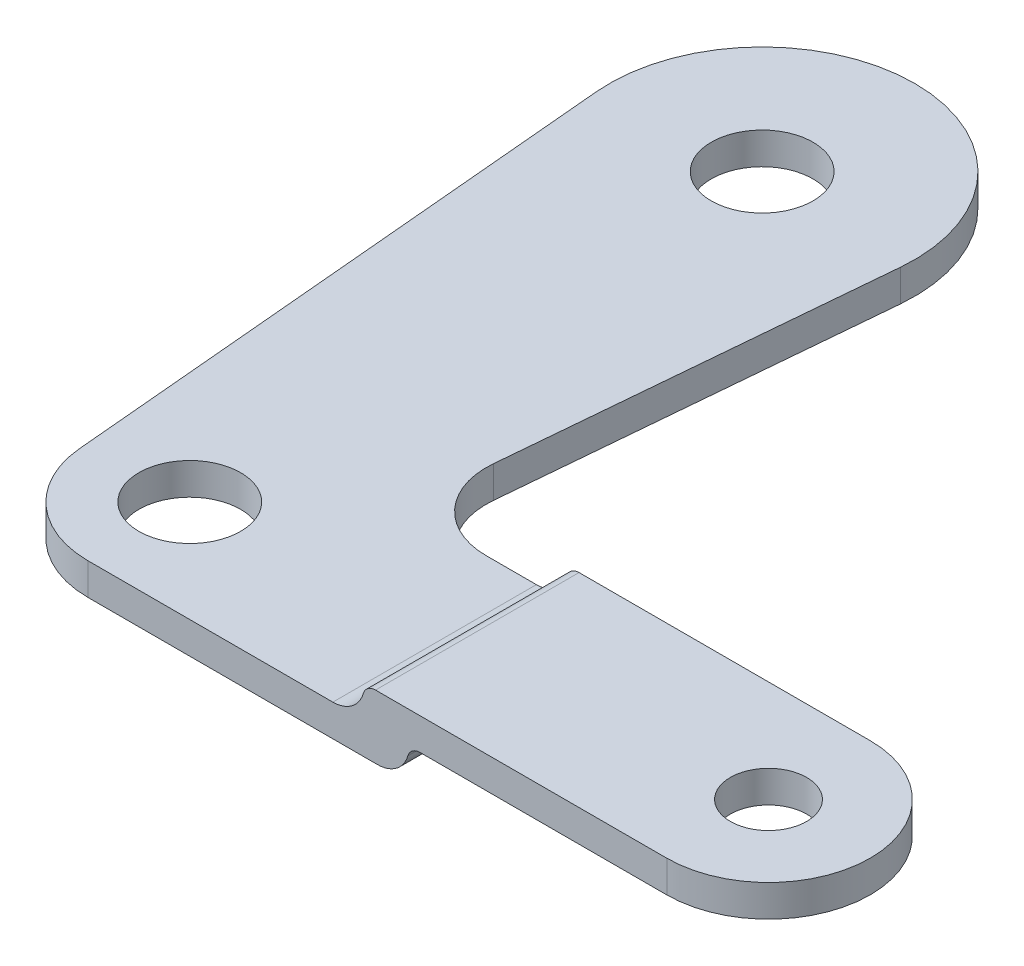
ISO-10303-21;
HEADER;
FILE_DESCRIPTION(('STEP AP214'),'2;1');
FILE_NAME('part.step','',(''),(''),'','','');
FILE_SCHEMA(('AUTOMOTIVE_DESIGN { 1 0 10303 214 1 1 1 1 }'));
ENDSEC;
DATA;
#1=APPLICATION_CONTEXT('core data for automotive mechanical design processes');
#2=APPLICATION_PROTOCOL_DEFINITION('international standard','automotive_design',2000,#1);
#3=PRODUCT_CONTEXT('',#1,'mechanical');
#4=PRODUCT('Part','Part','',(#3));
#5=PRODUCT_RELATED_PRODUCT_CATEGORY('part','',(#4));
#6=PRODUCT_DEFINITION_FORMATION('','',#4);
#7=PRODUCT_DEFINITION_CONTEXT('part definition',#1,'design');
#8=PRODUCT_DEFINITION('design','',#6,#7);
#9=PRODUCT_DEFINITION_SHAPE('','',#8);
#10=(LENGTH_UNIT() NAMED_UNIT(*) SI_UNIT(.MILLI.,.METRE.));
#11=(NAMED_UNIT(*) PLANE_ANGLE_UNIT() SI_UNIT($,.RADIAN.));
#12=(NAMED_UNIT(*) SI_UNIT($,.STERADIAN.) SOLID_ANGLE_UNIT());
#13=UNCERTAINTY_MEASURE_WITH_UNIT(LENGTH_MEASURE(1.E-05),#10,'distance_accuracy_value','');
#14=(GEOMETRIC_REPRESENTATION_CONTEXT(3) GLOBAL_UNCERTAINTY_ASSIGNED_CONTEXT((#13)) GLOBAL_UNIT_ASSIGNED_CONTEXT((#10,
#11,#12)) REPRESENTATION_CONTEXT('',''));
#15=CARTESIAN_POINT('',(0.,0.,0.));
#16=DIRECTION('',(0.,0.,1.));
#17=DIRECTION('',(1.,0.,0.));
#18=AXIS2_PLACEMENT_3D('',#15,#16,#17);
#19=CARTESIAN_POINT('',(0.,-2.5,0.));
#20=DIRECTION('',(0.,-1.,0.));
#21=DIRECTION('',(0.,0.,1.));
#22=AXIS2_PLACEMENT_3D('',#19,#20,#21);
#23=PLANE('',#22);
#24=CARTESIAN_POINT('',(45.5,-2.5,0.));
#25=DIRECTION('',(0.,1.,0.));
#26=DIRECTION('',(0.,0.,1.));
#27=AXIS2_PLACEMENT_3D('',#24,#25,#26);
#28=CIRCLE('',#27,3.);
#29=CARTESIAN_POINT('',(45.5,-2.5,2.99999999999999));
#30=VERTEX_POINT('',#29);
#31=EDGE_CURVE('E296',#30,#30,#28,.T.);
#32=ORIENTED_EDGE('',*,*,#31,.T.);
#33=EDGE_LOOP('',(#32));
#34=FACE_BOUND('',#33,.T.);
#35=DIRECTION('',(-1.,0.,0.));
#36=VECTOR('',#35,1.);
#37=CARTESIAN_POINT('',(0.,-2.5,-8.));
#38=LINE('',#37,#36);
#39=CARTESIAN_POINT('',(45.5,-2.5,-8.00000000000001));
#40=VERTEX_POINT('',#39);
#41=CARTESIAN_POINT('',(26.1041019662497,-2.5,-8.00000000000001));
#42=VERTEX_POINT('',#41);
#43=EDGE_CURVE('E287',#40,#42,#38,.T.);
#44=ORIENTED_EDGE('',*,*,#43,.F.);
#45=CARTESIAN_POINT('',(45.5,-2.5,0.));
#46=DIRECTION('',(0.,1.,0.));
#47=DIRECTION('',(0.,0.,1.));
#48=AXIS2_PLACEMENT_3D('',#45,#46,#47);
#49=CIRCLE('',#48,8.00000000000001);
#50=CARTESIAN_POINT('',(45.5,-2.5,8.00000000000001));
#51=VERTEX_POINT('',#50);
#52=EDGE_CURVE('E283',#40,#51,#49,.F.);
#53=ORIENTED_EDGE('',*,*,#52,.T.);
#54=DIRECTION('',(-1.,0.,0.));
#55=VECTOR('',#54,1.);
#56=CARTESIAN_POINT('',(0.,-2.5,8.00000000000002));
#57=LINE('',#56,#55);
#58=CARTESIAN_POINT('',(26.1041019662497,-2.5,8.00000000000002));
#59=VERTEX_POINT('',#58);
#60=EDGE_CURVE('E292',#51,#59,#57,.T.);
#61=ORIENTED_EDGE('',*,*,#60,.T.);
#62=DIRECTION('',(0.,0.,1.));
#63=VECTOR('',#62,1.);
#64=CARTESIAN_POINT('',(26.1041019662497,-2.5,-7.99999999999998));
#65=LINE('',#64,#63);
#66=EDGE_CURVE('E265',#42,#59,#65,.T.);
#67=ORIENTED_EDGE('',*,*,#66,.F.);
#68=EDGE_LOOP('',(#44,#53,#61,#67));
#69=FACE_BOUND('',#68,.T.);
#70=ADVANCED_FACE('F100',(#34,#69),#23,.T.);
#71=CARTESIAN_POINT('',(45.5,-2.5,0.));
#72=DIRECTION('',(0.,1.,0.));
#73=DIRECTION('',(0.,0.,-1.));
#74=AXIS2_PLACEMENT_3D('',#71,#72,#73);
#75=CYLINDRICAL_SURFACE('',#74,8.00000000000001);
#76=CARTESIAN_POINT('',(45.5,0.,0.));
#77=DIRECTION('',(0.,1.,0.));
#78=DIRECTION('',(0.,0.,1.));
#79=AXIS2_PLACEMENT_3D('',#76,#77,#78);
#80=CIRCLE('',#79,8.00000000000001);
#81=CARTESIAN_POINT('',(45.5,0.,-8.00000000000001));
#82=VERTEX_POINT('',#81);
#83=CARTESIAN_POINT('',(45.5,0.,8.00000000000001));
#84=VERTEX_POINT('',#83);
#85=EDGE_CURVE('E268',#82,#84,#80,.F.);
#86=ORIENTED_EDGE('',*,*,#85,.T.);
#87=DIRECTION('',(0.,1.,0.));
#88=VECTOR('',#87,1.);
#89=CARTESIAN_POINT('',(45.5,-2.5,8.00000000000001));
#90=LINE('',#89,#88);
#91=EDGE_CURVE('E109',#51,#84,#90,.T.);
#92=ORIENTED_EDGE('',*,*,#91,.F.);
#93=ORIENTED_EDGE('',*,*,#52,.F.);
#94=DIRECTION('',(0.,1.,0.));
#95=VECTOR('',#94,1.);
#96=CARTESIAN_POINT('',(45.5,-2.5,-8.00000000000001));
#97=LINE('',#96,#95);
#98=EDGE_CURVE('E12',#40,#82,#97,.T.);
#99=ORIENTED_EDGE('',*,*,#98,.T.);
#100=EDGE_LOOP('',(#86,#92,#93,#99));
#101=FACE_BOUND('',#100,.T.);
#102=ADVANCED_FACE('F102',(#101),#75,.T.);
#103=CARTESIAN_POINT('',(0.,-2.5,-8.));
#104=DIRECTION('',(0.,0.,1.));
#105=DIRECTION('',(1.,0.,0.));
#106=AXIS2_PLACEMENT_3D('',#103,#104,#105);
#107=PLANE('',#106);
#108=CARTESIAN_POINT('',(19.25,0.,-7.99999999999998));
#109=DIRECTION('',(0.,0.,-1.));
#110=DIRECTION('',(1.,0.,0.));
#111=AXIS2_PLACEMENT_3D('',#108,#109,#110);
#112=CIRCLE('',#111,2.5);
#113=CARTESIAN_POINT('',(19.25,-2.5,-8.00000000000001));
#114=VERTEX_POINT('',#113);
#115=CARTESIAN_POINT('',(21.6457871187498,-0.714285714285715,-7.99999999999998));
#116=VERTEX_POINT('',#115);
#117=EDGE_CURVE('E236',#114,#116,#112,.F.);
#118=ORIENTED_EDGE('',*,*,#117,.T.);
#119=CARTESIAN_POINT('',(22.6041019662497,-1.,-7.99999999999998));
#120=DIRECTION('',(0.,0.,-1.));
#121=DIRECTION('',(1.,0.,0.));
#122=AXIS2_PLACEMENT_3D('',#119,#120,#121);
#123=CIRCLE('',#122,1.);
#124=CARTESIAN_POINT('',(22.6041019662497,0.,-7.99999999999998));
#125=VERTEX_POINT('',#124);
#126=EDGE_CURVE('E240',#116,#125,#123,.T.);
#127=ORIENTED_EDGE('',*,*,#126,.T.);
#128=DIRECTION('',(-1.,0.,0.));
#129=VECTOR('',#128,1.);
#130=CARTESIAN_POINT('',(0.,0.,-8.));
#131=LINE('',#130,#129);
#132=EDGE_CURVE('E303',#82,#125,#131,.T.);
#133=ORIENTED_EDGE('',*,*,#132,.F.);
#134=ORIENTED_EDGE('',*,*,#98,.F.);
#135=ORIENTED_EDGE('',*,*,#43,.T.);
#136=CARTESIAN_POINT('',(26.1041019662497,-3.5,-7.99999999999998));
#137=DIRECTION('',(0.,0.,-1.));
#138=DIRECTION('',(1.,0.,0.));
#139=AXIS2_PLACEMENT_3D('',#136,#137,#138);
#140=CIRCLE('',#139,1.);
#141=CARTESIAN_POINT('',(25.1457871187498,-3.21428571428572,-7.99999999999998));
#142=VERTEX_POINT('',#141);
#143=EDGE_CURVE('E123',#142,#42,#140,.T.);
#144=ORIENTED_EDGE('',*,*,#143,.F.);
#145=CARTESIAN_POINT('',(22.75,-2.5,-7.99999999999998));
#146=DIRECTION('',(0.,0.,-1.));
#147=DIRECTION('',(1.,0.,0.));
#148=AXIS2_PLACEMENT_3D('',#145,#146,#147);
#149=CIRCLE('',#148,2.5);
#150=CARTESIAN_POINT('',(22.75,-5.,-7.99999999999998));
#151=VERTEX_POINT('',#150);
#152=EDGE_CURVE('E234',#151,#142,#149,.F.);
#153=ORIENTED_EDGE('',*,*,#152,.F.);
#154=DIRECTION('',(-1.,0.,0.));
#155=VECTOR('',#154,1.);
#156=CARTESIAN_POINT('',(0.,-5.,-7.99999999999998));
#157=LINE('',#156,#155);
#158=CARTESIAN_POINT('',(15.3050286650834,-5.,-8.));
#159=VERTEX_POINT('',#158);
#160=EDGE_CURVE('E211',#151,#159,#157,.T.);
#161=ORIENTED_EDGE('',*,*,#160,.T.);
#162=DIRECTION('',(0.,1.,0.));
#163=VECTOR('',#162,1.);
#164=CARTESIAN_POINT('',(15.3050286650834,-5.,-8.));
#165=LINE('',#164,#163);
#166=CARTESIAN_POINT('',(15.3050286650834,-2.5,-8.));
#167=VERTEX_POINT('',#166);
#168=EDGE_CURVE('E221',#159,#167,#165,.T.);
#169=ORIENTED_EDGE('',*,*,#168,.T.);
#170=DIRECTION('',(1.,0.,0.));
#171=VECTOR('',#170,1.);
#172=CARTESIAN_POINT('',(0.,-2.5,-8.));
#173=LINE('',#172,#171);
#174=EDGE_CURVE('E375',#167,#114,#173,.T.);
#175=ORIENTED_EDGE('',*,*,#174,.T.);
#176=EDGE_LOOP('',(#118,#127,#133,#134,#135,#144,#153,#161,#169,#175));
#177=FACE_BOUND('',#176,.T.);
#178=ADVANCED_FACE('F232',(#177),#107,.F.);
#179=CARTESIAN_POINT('',(0.,-2.5,8.00000000000002));
#180=DIRECTION('',(0.,0.,1.));
#181=DIRECTION('',(1.,0.,0.));
#182=AXIS2_PLACEMENT_3D('',#179,#180,#181);
#183=PLANE('',#182);
#184=DIRECTION('',(1.,0.,0.));
#185=VECTOR('',#184,1.);
#186=CARTESIAN_POINT('',(0.,-2.5,8.00000000000002));
#187=LINE('',#186,#185);
#188=CARTESIAN_POINT('',(0.,-2.5,8.00000000000001));
#189=VERTEX_POINT('',#188);
#190=CARTESIAN_POINT('',(19.25,-2.5,8.00000000000002));
#191=VERTEX_POINT('',#190);
#192=EDGE_CURVE('E218',#189,#191,#187,.T.);
#193=ORIENTED_EDGE('',*,*,#192,.F.);
#194=DIRECTION('',(0.,1.,0.));
#195=VECTOR('',#194,1.);
#196=CARTESIAN_POINT('',(0.,-5.,8.00000000000001));
#197=LINE('',#196,#195);
#198=CARTESIAN_POINT('',(0.,-5.,8.00000000000001));
#199=VERTEX_POINT('',#198);
#200=EDGE_CURVE('E345',#199,#189,#197,.T.);
#201=ORIENTED_EDGE('',*,*,#200,.F.);
#202=DIRECTION('',(-1.,0.,0.));
#203=VECTOR('',#202,1.);
#204=CARTESIAN_POINT('',(0.,-5.,8.00000000000002));
#205=LINE('',#204,#203);
#206=CARTESIAN_POINT('',(22.75,-5.,8.00000000000002));
#207=VERTEX_POINT('',#206);
#208=EDGE_CURVE('E254',#207,#199,#205,.T.);
#209=ORIENTED_EDGE('',*,*,#208,.F.);
#210=CARTESIAN_POINT('',(22.75,-2.5,8.00000000000002));
#211=DIRECTION('',(0.,0.,-1.));
#212=DIRECTION('',(1.,0.,0.));
#213=AXIS2_PLACEMENT_3D('',#210,#211,#212);
#214=CIRCLE('',#213,2.5);
#215=CARTESIAN_POINT('',(25.1457871187498,-3.21428571428572,8.00000000000002));
#216=VERTEX_POINT('',#215);
#217=EDGE_CURVE('E251',#207,#216,#214,.F.);
#218=ORIENTED_EDGE('',*,*,#217,.T.);
#219=CARTESIAN_POINT('',(26.1041019662497,-3.5,8.00000000000002));
#220=DIRECTION('',(0.,0.,-1.));
#221=DIRECTION('',(1.,0.,0.));
#222=AXIS2_PLACEMENT_3D('',#219,#220,#221);
#223=CIRCLE('',#222,1.);
#224=EDGE_CURVE('E116',#216,#59,#223,.T.);
#225=ORIENTED_EDGE('',*,*,#224,.T.);
#226=ORIENTED_EDGE('',*,*,#60,.F.);
#227=ORIENTED_EDGE('',*,*,#91,.T.);
#228=DIRECTION('',(-1.,0.,0.));
#229=VECTOR('',#228,1.);
#230=CARTESIAN_POINT('',(0.,0.,8.00000000000002));
#231=LINE('',#230,#229);
#232=CARTESIAN_POINT('',(22.6041019662497,0.,8.00000000000002));
#233=VERTEX_POINT('',#232);
#234=EDGE_CURVE('E307',#84,#233,#231,.T.);
#235=ORIENTED_EDGE('',*,*,#234,.T.);
#236=CARTESIAN_POINT('',(22.6041019662497,-1.,8.00000000000002));
#237=DIRECTION('',(0.,0.,-1.));
#238=DIRECTION('',(1.,0.,0.));
#239=AXIS2_PLACEMENT_3D('',#236,#237,#238);
#240=CIRCLE('',#239,1.);
#241=CARTESIAN_POINT('',(21.6457871187498,-0.714285714285715,8.00000000000002));
#242=VERTEX_POINT('',#241);
#243=EDGE_CURVE('E261',#242,#233,#240,.T.);
#244=ORIENTED_EDGE('',*,*,#243,.F.);
#245=CARTESIAN_POINT('',(19.25,0.,8.00000000000002));
#246=DIRECTION('',(0.,0.,-1.));
#247=DIRECTION('',(1.,0.,0.));
#248=AXIS2_PLACEMENT_3D('',#245,#246,#247);
#249=CIRCLE('',#248,2.5);
#250=EDGE_CURVE('E257',#191,#242,#249,.F.);
#251=ORIENTED_EDGE('',*,*,#250,.F.);
#252=EDGE_LOOP('',(#193,#201,#209,#218,#225,#226,#227,#235,#244,#251));
#253=FACE_BOUND('',#252,.T.);
#254=ADVANCED_FACE('F316',(#253),#183,.T.);
#255=CARTESIAN_POINT('',(45.5,-2.5,0.));
#256=DIRECTION('',(0.,1.,0.));
#257=DIRECTION('',(0.,0.,-1.));
#258=AXIS2_PLACEMENT_3D('',#255,#256,#257);
#259=CYLINDRICAL_SURFACE('',#258,3.);
#260=ORIENTED_EDGE('',*,*,#31,.F.);
#261=EDGE_LOOP('',(#260));
#262=FACE_BOUND('',#261,.T.);
#263=CARTESIAN_POINT('',(45.5,0.,0.));
#264=DIRECTION('',(0.,1.,0.));
#265=DIRECTION('',(0.,0.,1.));
#266=AXIS2_PLACEMENT_3D('',#263,#264,#265);
#267=CIRCLE('',#266,3.);
#268=CARTESIAN_POINT('',(45.5,0.,2.99999999999999));
#269=VERTEX_POINT('',#268);
#270=EDGE_CURVE('E288',#269,#269,#267,.T.);
#271=ORIENTED_EDGE('',*,*,#270,.T.);
#272=EDGE_LOOP('',(#271));
#273=FACE_BOUND('',#272,.T.);
#274=ADVANCED_FACE('F428',(#262,#273),#259,.F.);
#275=CARTESIAN_POINT('',(0.,0.,0.));
#276=DIRECTION('',(0.,-1.,0.));
#277=DIRECTION('',(0.,0.,1.));
#278=AXIS2_PLACEMENT_3D('',#275,#276,#277);
#279=PLANE('',#278);
#280=ORIENTED_EDGE('',*,*,#85,.F.);
#281=ORIENTED_EDGE('',*,*,#132,.T.);
#282=DIRECTION('',(0.,0.,1.));
#283=VECTOR('',#282,1.);
#284=CARTESIAN_POINT('',(22.6041019662497,0.,-7.99999999999998));
#285=LINE('',#284,#283);
#286=EDGE_CURVE('E269',#125,#233,#285,.T.);
#287=ORIENTED_EDGE('',*,*,#286,.T.);
#288=ORIENTED_EDGE('',*,*,#234,.F.);
#289=EDGE_LOOP('',(#280,#281,#287,#288));
#290=FACE_BOUND('',#289,.T.);
#291=ORIENTED_EDGE('',*,*,#270,.F.);
#292=EDGE_LOOP('',(#291));
#293=FACE_BOUND('',#292,.T.);
#294=ADVANCED_FACE('F322',(#290,#293),#279,.F.);
#295=CARTESIAN_POINT('',(26.1041019662497,-3.5,-7.99999999999998));
#296=DIRECTION('',(0.,0.,1.));
#297=DIRECTION('',(1.,0.,0.));
#298=AXIS2_PLACEMENT_3D('',#295,#296,#297);
#299=CYLINDRICAL_SURFACE('',#298,1.);
#300=ORIENTED_EDGE('',*,*,#224,.F.);
#301=DIRECTION('',(0.,0.,1.));
#302=VECTOR('',#301,1.);
#303=CARTESIAN_POINT('',(25.1457871187498,-3.21428571428572,-7.99999999999998));
#304=LINE('',#303,#302);
#305=EDGE_CURVE('E248',#142,#216,#304,.T.);
#306=ORIENTED_EDGE('',*,*,#305,.F.);
#307=ORIENTED_EDGE('',*,*,#143,.T.);
#308=ORIENTED_EDGE('',*,*,#66,.T.);
#309=EDGE_LOOP('',(#300,#306,#307,#308));
#310=FACE_BOUND('',#309,.T.);
#311=ADVANCED_FACE('F404',(#310),#299,.F.);
#312=CARTESIAN_POINT('',(22.6041019662497,-1.,-7.99999999999998));
#313=DIRECTION('',(0.,0.,1.));
#314=DIRECTION('',(1.,0.,0.));
#315=AXIS2_PLACEMENT_3D('',#312,#313,#314);
#316=CYLINDRICAL_SURFACE('',#315,1.);
#317=ORIENTED_EDGE('',*,*,#243,.T.);
#318=ORIENTED_EDGE('',*,*,#286,.F.);
#319=ORIENTED_EDGE('',*,*,#126,.F.);
#320=DIRECTION('',(0.,0.,1.));
#321=VECTOR('',#320,1.);
#322=CARTESIAN_POINT('',(21.6457871187498,-0.714285714285715,-7.99999999999998));
#323=LINE('',#322,#321);
#324=EDGE_CURVE('E272',#116,#242,#323,.T.);
#325=ORIENTED_EDGE('',*,*,#324,.T.);
#326=EDGE_LOOP('',(#317,#318,#319,#325));
#327=FACE_BOUND('',#326,.T.);
#328=ADVANCED_FACE('F326',(#327),#316,.T.);
#329=CARTESIAN_POINT('',(19.25,0.,-7.99999999999998));
#330=DIRECTION('',(0.,0.,1.));
#331=DIRECTION('',(1.,0.,0.));
#332=AXIS2_PLACEMENT_3D('',#329,#330,#331);
#333=CYLINDRICAL_SURFACE('',#332,2.5);
#334=ORIENTED_EDGE('',*,*,#250,.T.);
#335=ORIENTED_EDGE('',*,*,#324,.F.);
#336=ORIENTED_EDGE('',*,*,#117,.F.);
#337=DIRECTION('',(0.,0.,1.));
#338=VECTOR('',#337,1.);
#339=CARTESIAN_POINT('',(19.25,-2.5,-7.99999999999998));
#340=LINE('',#339,#338);
#341=EDGE_CURVE('E275',#114,#191,#340,.T.);
#342=ORIENTED_EDGE('',*,*,#341,.T.);
#343=EDGE_LOOP('',(#334,#335,#336,#342));
#344=FACE_BOUND('',#343,.T.);
#345=ADVANCED_FACE('F408',(#344),#333,.F.);
#346=CARTESIAN_POINT('',(0.,-5.,-7.99999999999998));
#347=DIRECTION('',(0.,-1.,0.));
#348=DIRECTION('',(0.,0.,1.));
#349=AXIS2_PLACEMENT_3D('',#346,#347,#348);
#350=PLANE('',#349);
#351=ORIENTED_EDGE('',*,*,#208,.T.);
#352=CARTESIAN_POINT('',(0.,-5.,0.));
#353=DIRECTION('',(0.,1.,0.));
#354=DIRECTION('',(0.,0.,1.));
#355=AXIS2_PLACEMENT_3D('',#352,#353,#354);
#356=CIRCLE('',#355,8.00000000000001);
#357=CARTESIAN_POINT('',(-7.96833238436088,-5.,0.71111111111111));
#358=VERTEX_POINT('',#357);
#359=EDGE_CURVE('E349',#358,#199,#356,.T.);
#360=ORIENTED_EDGE('',*,*,#359,.F.);
#361=DIRECTION('',(-0.0888888888888889,0.,-0.99604154804511));
#362=VECTOR('',#361,1.);
#363=CARTESIAN_POINT('',(-7.96833238436088,-5.,0.711111111111111));
#364=LINE('',#363,#362);
#365=CARTESIAN_POINT('',(-11.9524985765413,-5.,-43.9333333333334));
#366=VERTEX_POINT('',#365);
#367=EDGE_CURVE('E362',#358,#366,#364,.T.);
#368=ORIENTED_EDGE('',*,*,#367,.T.);
#369=CARTESIAN_POINT('',(0.,-5.,-45.));
#370=DIRECTION('',(0.,1.,0.));
#371=DIRECTION('',(0.,0.,1.));
#372=AXIS2_PLACEMENT_3D('',#369,#370,#371);
#373=CIRCLE('',#372,12.);
#374=CARTESIAN_POINT('',(11.9524985765413,-5.,-43.9333333333334));
#375=VERTEX_POINT('',#374);
#376=EDGE_CURVE('E366',#375,#366,#373,.T.);
#377=ORIENTED_EDGE('',*,*,#376,.F.);
#378=DIRECTION('',(0.0888888888888885,0.,-0.99604154804511));
#379=VECTOR('',#378,1.);
#380=CARTESIAN_POINT('',(7.9683323843609,-5.,0.71111111111111));
#381=LINE('',#380,#379);
#382=CARTESIAN_POINT('',(9.32877937681275,-5.,-14.5333333333333));
#383=VERTEX_POINT('',#382);
#384=EDGE_CURVE('E215',#383,#375,#381,.T.);
#385=ORIENTED_EDGE('',*,*,#384,.F.);
#386=CARTESIAN_POINT('',(15.3050286650834,-5.,-14.));
#387=DIRECTION('',(0.,1.,0.));
#388=DIRECTION('',(0.,0.,1.));
#389=AXIS2_PLACEMENT_3D('',#386,#387,#388);
#390=CIRCLE('',#389,6.);
#391=EDGE_CURVE('E205',#383,#159,#390,.T.);
#392=ORIENTED_EDGE('',*,*,#391,.T.);
#393=ORIENTED_EDGE('',*,*,#160,.F.);
#394=DIRECTION('',(0.,0.,1.));
#395=VECTOR('',#394,1.);
#396=CARTESIAN_POINT('',(22.75,-5.,-7.99999999999998));
#397=LINE('',#396,#395);
#398=EDGE_CURVE('E278',#151,#207,#397,.T.);
#399=ORIENTED_EDGE('',*,*,#398,.T.);
#400=EDGE_LOOP('',(#351,#360,#368,#377,#385,#392,#393,#399));
#401=FACE_BOUND('',#400,.T.);
#402=CARTESIAN_POINT('',(0.,-5.,0.));
#403=DIRECTION('',(0.,1.,0.));
#404=DIRECTION('',(0.,0.,1.));
#405=AXIS2_PLACEMENT_3D('',#402,#403,#404);
#406=CIRCLE('',#405,4.);
#407=CARTESIAN_POINT('',(0.,-5.,4.));
#408=VERTEX_POINT('',#407);
#409=EDGE_CURVE('E378',#408,#408,#406,.T.);
#410=ORIENTED_EDGE('',*,*,#409,.T.);
#411=EDGE_LOOP('',(#410));
#412=FACE_BOUND('',#411,.T.);
#413=CARTESIAN_POINT('',(0.,-5.,-45.));
#414=DIRECTION('',(0.,1.,0.));
#415=DIRECTION('',(0.,0.,1.));
#416=AXIS2_PLACEMENT_3D('',#413,#414,#415);
#417=CIRCLE('',#416,4.);
#418=CARTESIAN_POINT('',(0.,-5.,-41.));
#419=VERTEX_POINT('',#418);
#420=EDGE_CURVE('E561',#419,#419,#417,.T.);
#421=ORIENTED_EDGE('',*,*,#420,.T.);
#422=EDGE_LOOP('',(#421));
#423=FACE_BOUND('',#422,.T.);
#424=ADVANCED_FACE('F208',(#401,#412,#423),#350,.T.);
#425=CARTESIAN_POINT('',(22.75,-2.5,-7.99999999999998));
#426=DIRECTION('',(0.,0.,1.));
#427=DIRECTION('',(1.,0.,0.));
#428=AXIS2_PLACEMENT_3D('',#425,#426,#427);
#429=CYLINDRICAL_SURFACE('',#428,2.5);
#430=ORIENTED_EDGE('',*,*,#217,.F.);
#431=ORIENTED_EDGE('',*,*,#398,.F.);
#432=ORIENTED_EDGE('',*,*,#152,.T.);
#433=ORIENTED_EDGE('',*,*,#305,.T.);
#434=EDGE_LOOP('',(#430,#431,#432,#433));
#435=FACE_BOUND('',#434,.T.);
#436=ADVANCED_FACE('F403',(#435),#429,.T.);
#437=CARTESIAN_POINT('',(15.3050286650834,-2.5,-14.));
#438=DIRECTION('',(0.,-1.,0.));
#439=DIRECTION('',(0.,0.,1.));
#440=AXIS2_PLACEMENT_3D('',#437,#438,#439);
#441=PLANE('',#440);
#442=ORIENTED_EDGE('',*,*,#341,.F.);
#443=ORIENTED_EDGE('',*,*,#174,.F.);
#444=CARTESIAN_POINT('',(15.3050286650834,-2.5,-14.));
#445=DIRECTION('',(0.,1.,0.));
#446=DIRECTION('',(0.,0.,1.));
#447=AXIS2_PLACEMENT_3D('',#444,#445,#446);
#448=CIRCLE('',#447,6.);
#449=CARTESIAN_POINT('',(9.32877937681275,-2.5,-14.5333333333333));
#450=VERTEX_POINT('',#449);
#451=EDGE_CURVE('E224',#450,#167,#448,.T.);
#452=ORIENTED_EDGE('',*,*,#451,.F.);
#453=DIRECTION('',(0.0888888888888885,0.,-0.99604154804511));
#454=VECTOR('',#453,1.);
#455=CARTESIAN_POINT('',(7.9683323843609,-2.5,0.71111111111111));
#456=LINE('',#455,#454);
#457=CARTESIAN_POINT('',(11.9524985765413,-2.5,-43.9333333333334));
#458=VERTEX_POINT('',#457);
#459=EDGE_CURVE('E381',#450,#458,#456,.T.);
#460=ORIENTED_EDGE('',*,*,#459,.T.);
#461=CARTESIAN_POINT('',(0.,-2.5,-45.));
#462=DIRECTION('',(0.,1.,0.));
#463=DIRECTION('',(0.,0.,1.));
#464=AXIS2_PLACEMENT_3D('',#461,#462,#463);
#465=CIRCLE('',#464,12.);
#466=CARTESIAN_POINT('',(-11.9524985765413,-2.5,-43.9333333333334));
#467=VERTEX_POINT('',#466);
#468=EDGE_CURVE('E385',#458,#467,#465,.T.);
#469=ORIENTED_EDGE('',*,*,#468,.T.);
#470=DIRECTION('',(-0.0888888888888889,0.,-0.99604154804511));
#471=VECTOR('',#470,1.);
#472=CARTESIAN_POINT('',(-7.96833238436088,-2.5,0.711111111111111));
#473=LINE('',#472,#471);
#474=CARTESIAN_POINT('',(-7.96833238436088,-2.5,0.71111111111111));
#475=VERTEX_POINT('',#474);
#476=EDGE_CURVE('E341',#475,#467,#473,.T.);
#477=ORIENTED_EDGE('',*,*,#476,.F.);
#478=CARTESIAN_POINT('',(0.,-2.5,0.));
#479=DIRECTION('',(0.,1.,0.));
#480=DIRECTION('',(0.,0.,1.));
#481=AXIS2_PLACEMENT_3D('',#478,#479,#480);
#482=CIRCLE('',#481,8.00000000000001);
#483=EDGE_CURVE('E336',#475,#189,#482,.T.);
#484=ORIENTED_EDGE('',*,*,#483,.T.);
#485=ORIENTED_EDGE('',*,*,#192,.T.);
#486=EDGE_LOOP('',(#442,#443,#452,#460,#469,#477,#484,#485));
#487=FACE_BOUND('',#486,.T.);
#488=CARTESIAN_POINT('',(0.,-2.5,0.));
#489=DIRECTION('',(0.,1.,0.));
#490=DIRECTION('',(0.,0.,1.));
#491=AXIS2_PLACEMENT_3D('',#488,#489,#490);
#492=CIRCLE('',#491,4.);
#493=CARTESIAN_POINT('',(0.,-2.5,4.));
#494=VERTEX_POINT('',#493);
#495=EDGE_CURVE('E569',#494,#494,#492,.T.);
#496=ORIENTED_EDGE('',*,*,#495,.F.);
#497=EDGE_LOOP('',(#496));
#498=FACE_BOUND('',#497,.T.);
#499=CARTESIAN_POINT('',(0.,-2.5,-45.));
#500=DIRECTION('',(0.,1.,0.));
#501=DIRECTION('',(0.,0.,1.));
#502=AXIS2_PLACEMENT_3D('',#499,#500,#501);
#503=CIRCLE('',#502,4.);
#504=CARTESIAN_POINT('',(0.,-2.5,-41.));
#505=VERTEX_POINT('',#504);
#506=EDGE_CURVE('E564',#505,#505,#503,.T.);
#507=ORIENTED_EDGE('',*,*,#506,.F.);
#508=EDGE_LOOP('',(#507));
#509=FACE_BOUND('',#508,.T.);
#510=ADVANCED_FACE('F332',(#487,#498,#509),#441,.F.);
#511=CARTESIAN_POINT('',(15.3050286650834,-5.,-14.));
#512=DIRECTION('',(0.,1.,0.));
#513=DIRECTION('',(0.,0.,-1.));
#514=AXIS2_PLACEMENT_3D('',#511,#512,#513);
#515=CYLINDRICAL_SURFACE('',#514,6.);
#516=ORIENTED_EDGE('',*,*,#451,.T.);
#517=ORIENTED_EDGE('',*,*,#168,.F.);
#518=ORIENTED_EDGE('',*,*,#391,.F.);
#519=DIRECTION('',(0.,1.,0.));
#520=VECTOR('',#519,1.);
#521=CARTESIAN_POINT('',(9.32877937681275,-5.,-14.5333333333333));
#522=LINE('',#521,#520);
#523=EDGE_CURVE('E229',#383,#450,#522,.T.);
#524=ORIENTED_EDGE('',*,*,#523,.T.);
#525=EDGE_LOOP('',(#516,#517,#518,#524));
#526=FACE_BOUND('',#525,.T.);
#527=ADVANCED_FACE('F222',(#526),#515,.F.);
#528=CARTESIAN_POINT('',(7.9683323843609,-5.,0.71111111111111));
#529=DIRECTION('',(-0.99604154804511,0.,-0.0888888888888885));
#530=DIRECTION('',(-0.0888888888888885,0.,0.99604154804511));
#531=AXIS2_PLACEMENT_3D('',#528,#529,#530);
#532=PLANE('',#531);
#533=ORIENTED_EDGE('',*,*,#459,.F.);
#534=ORIENTED_EDGE('',*,*,#523,.F.);
#535=ORIENTED_EDGE('',*,*,#384,.T.);
#536=DIRECTION('',(0.,1.,0.));
#537=VECTOR('',#536,1.);
#538=CARTESIAN_POINT('',(11.9524985765413,-5.,-43.9333333333334));
#539=LINE('',#538,#537);
#540=EDGE_CURVE('E355',#375,#458,#539,.T.);
#541=ORIENTED_EDGE('',*,*,#540,.T.);
#542=EDGE_LOOP('',(#533,#534,#535,#541));
#543=FACE_BOUND('',#542,.T.);
#544=ADVANCED_FACE('F503',(#543),#532,.F.);
#545=CARTESIAN_POINT('',(0.,-5.,-45.));
#546=DIRECTION('',(0.,1.,0.));
#547=DIRECTION('',(0.,0.,-1.));
#548=AXIS2_PLACEMENT_3D('',#545,#546,#547);
#549=CYLINDRICAL_SURFACE('',#548,12.);
#550=ORIENTED_EDGE('',*,*,#468,.F.);
#551=ORIENTED_EDGE('',*,*,#540,.F.);
#552=ORIENTED_EDGE('',*,*,#376,.T.);
#553=DIRECTION('',(0.,1.,0.));
#554=VECTOR('',#553,1.);
#555=CARTESIAN_POINT('',(-11.9524985765413,-5.,-43.9333333333334));
#556=LINE('',#555,#554);
#557=EDGE_CURVE('E352',#366,#467,#556,.T.);
#558=ORIENTED_EDGE('',*,*,#557,.T.);
#559=EDGE_LOOP('',(#550,#551,#552,#558));
#560=FACE_BOUND('',#559,.T.);
#561=ADVANCED_FACE('F396',(#560),#549,.T.);
#562=CARTESIAN_POINT('',(-7.96833238436088,-5.,0.711111111111111));
#563=DIRECTION('',(-0.99604154804511,0.,0.0888888888888889));
#564=DIRECTION('',(0.0888888888888889,0.,0.99604154804511));
#565=AXIS2_PLACEMENT_3D('',#562,#563,#564);
#566=PLANE('',#565);
#567=ORIENTED_EDGE('',*,*,#476,.T.);
#568=ORIENTED_EDGE('',*,*,#557,.F.);
#569=ORIENTED_EDGE('',*,*,#367,.F.);
#570=DIRECTION('',(0.,1.,0.));
#571=VECTOR('',#570,1.);
#572=CARTESIAN_POINT('',(-7.96833238436088,-5.,0.71111111111111));
#573=LINE('',#572,#571);
#574=EDGE_CURVE('E348',#358,#475,#573,.T.);
#575=ORIENTED_EDGE('',*,*,#574,.T.);
#576=EDGE_LOOP('',(#567,#568,#569,#575));
#577=FACE_BOUND('',#576,.T.);
#578=ADVANCED_FACE('F391',(#577),#566,.T.);
#579=CARTESIAN_POINT('',(0.,-5.,0.));
#580=DIRECTION('',(0.,1.,0.));
#581=DIRECTION('',(0.,0.,-1.));
#582=AXIS2_PLACEMENT_3D('',#579,#580,#581);
#583=CYLINDRICAL_SURFACE('',#582,8.00000000000001);
#584=ORIENTED_EDGE('',*,*,#483,.F.);
#585=ORIENTED_EDGE('',*,*,#574,.F.);
#586=ORIENTED_EDGE('',*,*,#359,.T.);
#587=ORIENTED_EDGE('',*,*,#200,.T.);
#588=EDGE_LOOP('',(#584,#585,#586,#587));
#589=FACE_BOUND('',#588,.T.);
#590=ADVANCED_FACE('F400',(#589),#583,.T.);
#591=CARTESIAN_POINT('',(0.,-5.,0.));
#592=DIRECTION('',(0.,1.,0.));
#593=DIRECTION('',(0.,0.,-1.));
#594=AXIS2_PLACEMENT_3D('',#591,#592,#593);
#595=CYLINDRICAL_SURFACE('',#594,4.);
#596=ORIENTED_EDGE('',*,*,#409,.F.);
#597=EDGE_LOOP('',(#596));
#598=FACE_BOUND('',#597,.T.);
#599=ORIENTED_EDGE('',*,*,#495,.T.);
#600=EDGE_LOOP('',(#599));
#601=FACE_BOUND('',#600,.T.);
#602=ADVANCED_FACE('F536',(#598,#601),#595,.F.);
#603=CARTESIAN_POINT('',(0.,-5.,-45.));
#604=DIRECTION('',(0.,1.,0.));
#605=DIRECTION('',(0.,0.,-1.));
#606=AXIS2_PLACEMENT_3D('',#603,#604,#605);
#607=CYLINDRICAL_SURFACE('',#606,4.);
#608=ORIENTED_EDGE('',*,*,#420,.F.);
#609=EDGE_LOOP('',(#608));
#610=FACE_BOUND('',#609,.T.);
#611=ORIENTED_EDGE('',*,*,#506,.T.);
#612=EDGE_LOOP('',(#611));
#613=FACE_BOUND('',#612,.T.);
#614=ADVANCED_FACE('F545',(#610,#613),#607,.F.);
#615=CLOSED_SHELL('',(#70,#102,#178,#254,#274,#294,#311,#328,#345,#424,#436,#510,#527,#544,#561,
#578,#590,#602,#614));
#616=MANIFOLD_SOLID_BREP('B2',#615);
#617=ADVANCED_BREP_SHAPE_REPRESENTATION('',(#18,#616),#14);
#618=SHAPE_DEFINITION_REPRESENTATION(#9,#617);
ENDSEC;
END-ISO-10303-21;
